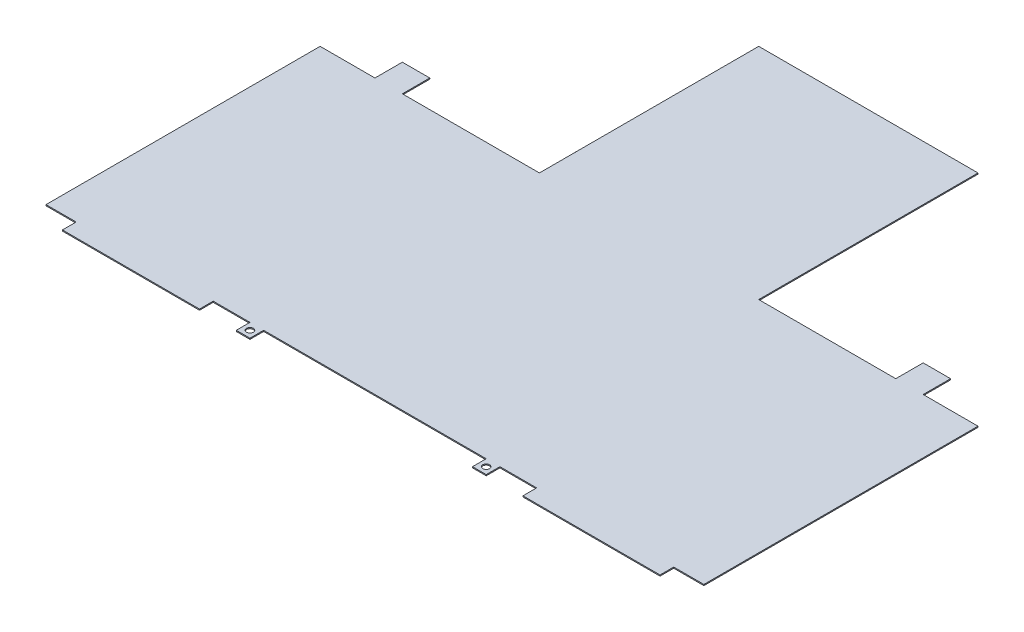
ISO-10303-21;
HEADER;
FILE_DESCRIPTION(('STEP AP214'),'2;1');
FILE_NAME('part.step','',(''),(''),'','','');
FILE_SCHEMA(('AUTOMOTIVE_DESIGN { 1 0 10303 214 1 1 1 1 }'));
ENDSEC;
DATA;
#1=APPLICATION_CONTEXT('core data for automotive mechanical design processes');
#2=APPLICATION_PROTOCOL_DEFINITION('international standard','automotive_design',2000,#1);
#3=PRODUCT_CONTEXT('',#1,'mechanical');
#4=PRODUCT('Part','Part','',(#3));
#5=PRODUCT_RELATED_PRODUCT_CATEGORY('part','',(#4));
#6=PRODUCT_DEFINITION_FORMATION('','',#4);
#7=PRODUCT_DEFINITION_CONTEXT('part definition',#1,'design');
#8=PRODUCT_DEFINITION('design','',#6,#7);
#9=PRODUCT_DEFINITION_SHAPE('','',#8);
#10=(LENGTH_UNIT() NAMED_UNIT(*) SI_UNIT(.MILLI.,.METRE.));
#11=(NAMED_UNIT(*) PLANE_ANGLE_UNIT() SI_UNIT($,.RADIAN.));
#12=(NAMED_UNIT(*) SI_UNIT($,.STERADIAN.) SOLID_ANGLE_UNIT());
#13=UNCERTAINTY_MEASURE_WITH_UNIT(LENGTH_MEASURE(1.E-05),#10,'distance_accuracy_value','');
#14=(GEOMETRIC_REPRESENTATION_CONTEXT(3) GLOBAL_UNCERTAINTY_ASSIGNED_CONTEXT((#13)) GLOBAL_UNIT_ASSIGNED_CONTEXT((#10,
#11,#12)) REPRESENTATION_CONTEXT('',''));
#15=CARTESIAN_POINT('',(0.,0.,0.));
#16=DIRECTION('',(0.,0.,1.));
#17=DIRECTION('',(1.,0.,0.));
#18=AXIS2_PLACEMENT_3D('',#15,#16,#17);
#19=CARTESIAN_POINT('',(-304.8,-1.,127.));
#20=DIRECTION('',(0.,0.,1.));
#21=DIRECTION('',(1.,0.,0.));
#22=AXIS2_PLACEMENT_3D('',#19,#20,#21);
#23=PLANE('',#22);
#24=DIRECTION('',(0.,1.,0.));
#25=VECTOR('',#24,1.);
#26=CARTESIAN_POINT('',(103.1,-1.,127.));
#27=LINE('',#26,#25);
#28=CARTESIAN_POINT('',(103.1,-1.,127.));
#29=VERTEX_POINT('',#28);
#30=CARTESIAN_POINT('',(103.1,0.,127.));
#31=VERTEX_POINT('',#30);
#32=EDGE_CURVE('E274',#29,#31,#27,.T.);
#33=ORIENTED_EDGE('',*,*,#32,.T.);
#34=DIRECTION('',(1.,0.,0.));
#35=VECTOR('',#34,1.);
#36=CARTESIAN_POINT('',(-304.8,0.,127.));
#37=LINE('',#36,#35);
#38=CARTESIAN_POINT('',(-103.1,0.,127.));
#39=VERTEX_POINT('',#38);
#40=EDGE_CURVE('E398',#39,#31,#37,.T.);
#41=ORIENTED_EDGE('',*,*,#40,.F.);
#42=DIRECTION('',(0.,1.,0.));
#43=VECTOR('',#42,1.);
#44=CARTESIAN_POINT('',(-103.1,-1.,127.));
#45=LINE('',#44,#43);
#46=CARTESIAN_POINT('',(-103.1,-1.,127.));
#47=VERTEX_POINT('',#46);
#48=EDGE_CURVE('E308',#47,#39,#45,.T.);
#49=ORIENTED_EDGE('',*,*,#48,.F.);
#50=DIRECTION('',(1.,0.,0.));
#51=VECTOR('',#50,1.);
#52=CARTESIAN_POINT('',(-304.8,-1.,127.));
#53=LINE('',#52,#51);
#54=EDGE_CURVE('E400',#47,#29,#53,.T.);
#55=ORIENTED_EDGE('',*,*,#54,.T.);
#56=EDGE_LOOP('',(#33,#41,#49,#55));
#57=FACE_BOUND('',#56,.T.);
#58=ADVANCED_FACE('F37',(#57),#23,.T.);
#59=DIRECTION('',(0.,1.,0.));
#60=VECTOR('',#59,1.);
#61=CARTESIAN_POINT('',(-115.8,-1.,127.));
#62=LINE('',#61,#60);
#63=CARTESIAN_POINT('',(-115.8,-1.,127.));
#64=VERTEX_POINT('',#63);
#65=CARTESIAN_POINT('',(-115.8,0.,127.));
#66=VERTEX_POINT('',#65);
#67=EDGE_CURVE('E304',#64,#66,#62,.T.);
#68=ORIENTED_EDGE('',*,*,#67,.T.);
#69=CARTESIAN_POINT('',(-149.86,0.,127.));
#70=VERTEX_POINT('',#69);
#71=EDGE_CURVE('E391',#70,#66,#37,.T.);
#72=ORIENTED_EDGE('',*,*,#71,.F.);
#73=DIRECTION('',(0.,1.,0.));
#74=VECTOR('',#73,1.);
#75=CARTESIAN_POINT('',(-149.86,-1.,127.));
#76=LINE('',#75,#74);
#77=CARTESIAN_POINT('',(-149.86,-1.,127.));
#78=VERTEX_POINT('',#77);
#79=EDGE_CURVE('E342',#78,#70,#76,.T.);
#80=ORIENTED_EDGE('',*,*,#79,.F.);
#81=EDGE_CURVE('E401',#78,#64,#53,.T.);
#82=ORIENTED_EDGE('',*,*,#81,.T.);
#83=EDGE_LOOP('',(#68,#72,#80,#82));
#84=FACE_BOUND('',#83,.T.);
#85=ADVANCED_FACE('F424',(#84),#23,.T.);
#86=DIRECTION('',(0.,1.,0.));
#87=VECTOR('',#86,1.);
#88=CARTESIAN_POINT('',(115.8,-1.,127.));
#89=LINE('',#88,#87);
#90=CARTESIAN_POINT('',(115.8,-1.,127.));
#91=VERTEX_POINT('',#90);
#92=CARTESIAN_POINT('',(115.8,0.,127.));
#93=VERTEX_POINT('',#92);
#94=EDGE_CURVE('E287',#91,#93,#89,.T.);
#95=ORIENTED_EDGE('',*,*,#94,.F.);
#96=CARTESIAN_POINT('',(149.859999999997,-1.,127.));
#97=VERTEX_POINT('',#96);
#98=EDGE_CURVE('E41',#91,#97,#53,.T.);
#99=ORIENTED_EDGE('',*,*,#98,.T.);
#100=DIRECTION('',(0.,1.,0.));
#101=VECTOR('',#100,1.);
#102=CARTESIAN_POINT('',(149.859999999997,-1.,127.));
#103=LINE('',#102,#101);
#104=CARTESIAN_POINT('',(149.859999999997,0.,127.));
#105=VERTEX_POINT('',#104);
#106=EDGE_CURVE('E329',#97,#105,#103,.T.);
#107=ORIENTED_EDGE('',*,*,#106,.T.);
#108=EDGE_CURVE('E380',#93,#105,#37,.T.);
#109=ORIENTED_EDGE('',*,*,#108,.F.);
#110=EDGE_LOOP('',(#95,#99,#107,#109));
#111=FACE_BOUND('',#110,.T.);
#112=ADVANCED_FACE('F516',(#111),#23,.T.);
#113=CARTESIAN_POINT('',(-304.8,-1.,127.));
#114=VERTEX_POINT('',#113);
#115=CARTESIAN_POINT('',(-276.86,-1.,127.));
#116=VERTEX_POINT('',#115);
#117=EDGE_CURVE('E413',#114,#116,#53,.T.);
#118=ORIENTED_EDGE('',*,*,#117,.T.);
#119=DIRECTION('',(0.,1.,0.));
#120=VECTOR('',#119,1.);
#121=CARTESIAN_POINT('',(-276.86,-1.,127.));
#122=LINE('',#121,#120);
#123=CARTESIAN_POINT('',(-276.86,0.,127.));
#124=VERTEX_POINT('',#123);
#125=EDGE_CURVE('E354',#116,#124,#122,.T.);
#126=ORIENTED_EDGE('',*,*,#125,.T.);
#127=CARTESIAN_POINT('',(-304.8,0.,127.));
#128=VERTEX_POINT('',#127);
#129=EDGE_CURVE('E396',#128,#124,#37,.T.);
#130=ORIENTED_EDGE('',*,*,#129,.F.);
#131=DIRECTION('',(0.,1.,0.));
#132=VECTOR('',#131,1.);
#133=CARTESIAN_POINT('',(-304.8,-1.,127.));
#134=LINE('',#133,#132);
#135=EDGE_CURVE('E47',#114,#128,#134,.T.);
#136=ORIENTED_EDGE('',*,*,#135,.F.);
#137=EDGE_LOOP('',(#118,#126,#130,#136));
#138=FACE_BOUND('',#137,.T.);
#139=ADVANCED_FACE('F487',(#138),#23,.T.);
#140=CARTESIAN_POINT('',(-304.8,-1.,-127.));
#141=DIRECTION('',(0.,0.,-1.));
#142=DIRECTION('',(-1.,0.,0.));
#143=AXIS2_PLACEMENT_3D('',#140,#141,#142);
#144=PLANE('',#143);
#145=DIRECTION('',(0.,1.,0.));
#146=VECTOR('',#145,1.);
#147=CARTESIAN_POINT('',(-101.6,-1.,-127.));
#148=LINE('',#147,#146);
#149=CARTESIAN_POINT('',(-101.6,-1.,-127.));
#150=VERTEX_POINT('',#149);
#151=CARTESIAN_POINT('',(-101.6,0.,-127.));
#152=VERTEX_POINT('',#151);
#153=EDGE_CURVE('E635',#150,#152,#148,.T.);
#154=ORIENTED_EDGE('',*,*,#153,.F.);
#155=DIRECTION('',(-1.,0.,0.));
#156=VECTOR('',#155,1.);
#157=CARTESIAN_POINT('',(-304.8,-1.,-127.));
#158=LINE('',#157,#156);
#159=CARTESIAN_POINT('',(-228.6,-1.,-127.));
#160=VERTEX_POINT('',#159);
#161=EDGE_CURVE('E448',#150,#160,#158,.T.);
#162=ORIENTED_EDGE('',*,*,#161,.T.);
#163=DIRECTION('',(0.,1.,0.));
#164=VECTOR('',#163,1.);
#165=CARTESIAN_POINT('',(-228.6,-1.,-127.));
#166=LINE('',#165,#164);
#167=CARTESIAN_POINT('',(-228.6,0.,-127.));
#168=VERTEX_POINT('',#167);
#169=EDGE_CURVE('E597',#160,#168,#166,.T.);
#170=ORIENTED_EDGE('',*,*,#169,.T.);
#171=DIRECTION('',(-1.,0.,0.));
#172=VECTOR('',#171,1.);
#173=CARTESIAN_POINT('',(-304.8,0.,-127.));
#174=LINE('',#173,#172);
#175=EDGE_CURVE('E468',#152,#168,#174,.T.);
#176=ORIENTED_EDGE('',*,*,#175,.F.);
#177=EDGE_LOOP('',(#154,#162,#170,#176));
#178=FACE_BOUND('',#177,.T.);
#179=ADVANCED_FACE('F529',(#178),#144,.T.);
#180=DIRECTION('',(0.,1.,0.));
#181=VECTOR('',#180,1.);
#182=CARTESIAN_POINT('',(101.6,-1.,-127.));
#183=LINE('',#182,#181);
#184=CARTESIAN_POINT('',(101.6,-1.,-127.));
#185=VERTEX_POINT('',#184);
#186=CARTESIAN_POINT('',(101.6,0.,-127.));
#187=VERTEX_POINT('',#186);
#188=EDGE_CURVE('E638',#185,#187,#183,.T.);
#189=ORIENTED_EDGE('',*,*,#188,.T.);
#190=CARTESIAN_POINT('',(228.6,0.,-127.));
#191=VERTEX_POINT('',#190);
#192=EDGE_CURVE('E466',#191,#187,#174,.T.);
#193=ORIENTED_EDGE('',*,*,#192,.F.);
#194=DIRECTION('',(0.,1.,0.));
#195=VECTOR('',#194,1.);
#196=CARTESIAN_POINT('',(228.6,-1.,-127.));
#197=LINE('',#196,#195);
#198=CARTESIAN_POINT('',(228.6,-1.,-127.));
#199=VERTEX_POINT('',#198);
#200=EDGE_CURVE('E562',#199,#191,#197,.T.);
#201=ORIENTED_EDGE('',*,*,#200,.F.);
#202=EDGE_CURVE('E462',#199,#185,#158,.T.);
#203=ORIENTED_EDGE('',*,*,#202,.T.);
#204=EDGE_LOOP('',(#189,#193,#201,#203));
#205=FACE_BOUND('',#204,.T.);
#206=ADVANCED_FACE('F534',(#205),#144,.T.);
#207=DIRECTION('',(0.,1.,0.));
#208=VECTOR('',#207,1.);
#209=CARTESIAN_POINT('',(254.,-1.,-127.));
#210=LINE('',#209,#208);
#211=CARTESIAN_POINT('',(254.,-1.,-127.));
#212=VERTEX_POINT('',#211);
#213=CARTESIAN_POINT('',(254.,0.,-127.));
#214=VERTEX_POINT('',#213);
#215=EDGE_CURVE('E551',#212,#214,#210,.T.);
#216=ORIENTED_EDGE('',*,*,#215,.T.);
#217=CARTESIAN_POINT('',(304.8,0.,-127.));
#218=VERTEX_POINT('',#217);
#219=EDGE_CURVE('E475',#218,#214,#174,.T.);
#220=ORIENTED_EDGE('',*,*,#219,.F.);
#221=DIRECTION('',(0.,1.,0.));
#222=VECTOR('',#221,1.);
#223=CARTESIAN_POINT('',(304.8,-1.,-127.));
#224=LINE('',#223,#222);
#225=CARTESIAN_POINT('',(304.8,-1.,-127.));
#226=VERTEX_POINT('',#225);
#227=EDGE_CURVE('E415',#226,#218,#224,.T.);
#228=ORIENTED_EDGE('',*,*,#227,.F.);
#229=EDGE_CURVE('E459',#226,#212,#158,.T.);
#230=ORIENTED_EDGE('',*,*,#229,.T.);
#231=EDGE_LOOP('',(#216,#220,#228,#230));
#232=FACE_BOUND('',#231,.T.);
#233=ADVANCED_FACE('F526',(#232),#144,.T.);
#234=CARTESIAN_POINT('',(304.8,-1.,127.));
#235=DIRECTION('',(1.,0.,0.));
#236=DIRECTION('',(0.,0.,-1.));
#237=AXIS2_PLACEMENT_3D('',#234,#235,#236);
#238=PLANE('',#237);
#239=DIRECTION('',(0.,0.,-1.));
#240=VECTOR('',#239,1.);
#241=CARTESIAN_POINT('',(304.8,0.,127.));
#242=LINE('',#241,#240);
#243=CARTESIAN_POINT('',(304.8,0.,127.));
#244=VERTEX_POINT('',#243);
#245=EDGE_CURVE('E407',#244,#218,#242,.T.);
#246=ORIENTED_EDGE('',*,*,#245,.F.);
#247=DIRECTION('',(0.,1.,0.));
#248=VECTOR('',#247,1.);
#249=CARTESIAN_POINT('',(304.8,-1.,127.));
#250=LINE('',#249,#248);
#251=CARTESIAN_POINT('',(304.8,-1.,127.));
#252=VERTEX_POINT('',#251);
#253=EDGE_CURVE('E11',#252,#244,#250,.T.);
#254=ORIENTED_EDGE('',*,*,#253,.F.);
#255=DIRECTION('',(0.,0.,-1.));
#256=VECTOR('',#255,1.);
#257=CARTESIAN_POINT('',(304.8,-1.,127.));
#258=LINE('',#257,#256);
#259=EDGE_CURVE('E439',#252,#226,#258,.T.);
#260=ORIENTED_EDGE('',*,*,#259,.T.);
#261=ORIENTED_EDGE('',*,*,#227,.T.);
#262=EDGE_LOOP('',(#246,#254,#260,#261));
#263=FACE_BOUND('',#262,.T.);
#264=ADVANCED_FACE('F39',(#263),#238,.T.);
#265=DIRECTION('',(0.,1.,0.));
#266=VECTOR('',#265,1.);
#267=CARTESIAN_POINT('',(276.859999999999,-1.,127.));
#268=LINE('',#267,#266);
#269=CARTESIAN_POINT('',(276.859999999999,-1.,127.));
#270=VERTEX_POINT('',#269);
#271=CARTESIAN_POINT('',(276.859999999999,0.,127.));
#272=VERTEX_POINT('',#271);
#273=EDGE_CURVE('E333',#270,#272,#268,.T.);
#274=ORIENTED_EDGE('',*,*,#273,.F.);
#275=EDGE_CURVE('E382',#270,#252,#53,.T.);
#276=ORIENTED_EDGE('',*,*,#275,.T.);
#277=ORIENTED_EDGE('',*,*,#253,.T.);
#278=EDGE_CURVE('E377',#272,#244,#37,.T.);
#279=ORIENTED_EDGE('',*,*,#278,.F.);
#280=EDGE_LOOP('',(#274,#276,#277,#279));
#281=FACE_BOUND('',#280,.T.);
#282=ADVANCED_FACE('F512',(#281),#23,.T.);
#283=CARTESIAN_POINT('',(-304.8,-1.,127.));
#284=DIRECTION('',(-1.,0.,0.));
#285=DIRECTION('',(0.,0.,1.));
#286=AXIS2_PLACEMENT_3D('',#283,#284,#285);
#287=PLANE('',#286);
#288=DIRECTION('',(0.,0.,1.));
#289=VECTOR('',#288,1.);
#290=CARTESIAN_POINT('',(-304.8,0.,127.));
#291=LINE('',#290,#289);
#292=CARTESIAN_POINT('',(-304.8,0.,-127.));
#293=VERTEX_POINT('',#292);
#294=EDGE_CURVE('E381',#293,#128,#291,.T.);
#295=ORIENTED_EDGE('',*,*,#294,.F.);
#296=DIRECTION('',(0.,1.,0.));
#297=VECTOR('',#296,1.);
#298=CARTESIAN_POINT('',(-304.8,-1.,-127.));
#299=LINE('',#298,#297);
#300=CARTESIAN_POINT('',(-304.8,-1.,-127.));
#301=VERTEX_POINT('',#300);
#302=EDGE_CURVE('E418',#301,#293,#299,.T.);
#303=ORIENTED_EDGE('',*,*,#302,.F.);
#304=DIRECTION('',(0.,0.,1.));
#305=VECTOR('',#304,1.);
#306=CARTESIAN_POINT('',(-304.8,-1.,127.));
#307=LINE('',#306,#305);
#308=EDGE_CURVE('E405',#301,#114,#307,.T.);
#309=ORIENTED_EDGE('',*,*,#308,.T.);
#310=ORIENTED_EDGE('',*,*,#135,.T.);
#311=EDGE_LOOP('',(#295,#303,#309,#310));
#312=FACE_BOUND('',#311,.T.);
#313=ADVANCED_FACE('F482',(#312),#287,.T.);
#314=DIRECTION('',(0.,1.,0.));
#315=VECTOR('',#314,1.);
#316=CARTESIAN_POINT('',(-254.,-1.,-127.));
#317=LINE('',#316,#315);
#318=CARTESIAN_POINT('',(-254.,-1.,-127.));
#319=VERTEX_POINT('',#318);
#320=CARTESIAN_POINT('',(-254.,0.,-127.));
#321=VERTEX_POINT('',#320);
#322=EDGE_CURVE('E587',#319,#321,#317,.T.);
#323=ORIENTED_EDGE('',*,*,#322,.F.);
#324=EDGE_CURVE('E444',#319,#301,#158,.T.);
#325=ORIENTED_EDGE('',*,*,#324,.T.);
#326=ORIENTED_EDGE('',*,*,#302,.T.);
#327=EDGE_CURVE('E469',#321,#293,#174,.T.);
#328=ORIENTED_EDGE('',*,*,#327,.F.);
#329=EDGE_LOOP('',(#323,#325,#326,#328));
#330=FACE_BOUND('',#329,.T.);
#331=ADVANCED_FACE('F525',(#330),#144,.T.);
#332=CARTESIAN_POINT('',(0.,-1.,0.));
#333=DIRECTION('',(0.,-1.,0.));
#334=DIRECTION('',(0.,0.,-1.));
#335=AXIS2_PLACEMENT_3D('',#332,#333,#334);
#336=PLANE('',#335);
#337=CARTESIAN_POINT('',(109.45,-1.,133.35));
#338=DIRECTION('',(0.,-1.,0.));
#339=DIRECTION('',(0.,0.,-1.));
#340=AXIS2_PLACEMENT_3D('',#337,#338,#339);
#341=CIRCLE('',#340,3.15);
#342=CARTESIAN_POINT('',(109.45,-1.,130.2));
#343=VERTEX_POINT('',#342);
#344=EDGE_CURVE('E859',#343,#343,#341,.T.);
#345=ORIENTED_EDGE('',*,*,#344,.F.);
#346=EDGE_LOOP('',(#345));
#347=FACE_BOUND('',#346,.T.);
#348=CARTESIAN_POINT('',(-109.45,-1.,133.35));
#349=DIRECTION('',(0.,-1.,0.));
#350=DIRECTION('',(0.,0.,-1.));
#351=AXIS2_PLACEMENT_3D('',#348,#349,#350);
#352=CIRCLE('',#351,3.15);
#353=CARTESIAN_POINT('',(-109.45,-1.,130.2));
#354=VERTEX_POINT('',#353);
#355=EDGE_CURVE('E278',#354,#354,#352,.T.);
#356=ORIENTED_EDGE('',*,*,#355,.F.);
#357=EDGE_LOOP('',(#356));
#358=FACE_BOUND('',#357,.T.);
#359=ORIENTED_EDGE('',*,*,#259,.F.);
#360=ORIENTED_EDGE('',*,*,#275,.F.);
#361=DIRECTION('',(0.,0.,-1.));
#362=VECTOR('',#361,1.);
#363=CARTESIAN_POINT('',(276.859999999999,-1.,127.));
#364=LINE('',#363,#362);
#365=CARTESIAN_POINT('',(276.859999999999,-1.,139.7));
#366=VERTEX_POINT('',#365);
#367=EDGE_CURVE('E320',#366,#270,#364,.T.);
#368=ORIENTED_EDGE('',*,*,#367,.F.);
#369=DIRECTION('',(1.,0.,0.));
#370=VECTOR('',#369,1.);
#371=CARTESIAN_POINT('',(149.859999999997,-1.,139.7));
#372=LINE('',#371,#370);
#373=CARTESIAN_POINT('',(149.859999999997,-1.,139.7));
#374=VERTEX_POINT('',#373);
#375=EDGE_CURVE('E316',#374,#366,#372,.T.);
#376=ORIENTED_EDGE('',*,*,#375,.F.);
#377=DIRECTION('',(0.,0.,1.));
#378=VECTOR('',#377,1.);
#379=CARTESIAN_POINT('',(149.859999999997,-1.,127.));
#380=LINE('',#379,#378);
#381=EDGE_CURVE('E313',#97,#374,#380,.T.);
#382=ORIENTED_EDGE('',*,*,#381,.F.);
#383=ORIENTED_EDGE('',*,*,#98,.F.);
#384=DIRECTION('',(0.,0.,-1.));
#385=VECTOR('',#384,1.);
#386=CARTESIAN_POINT('',(115.8,-1.,127.));
#387=LINE('',#386,#385);
#388=CARTESIAN_POINT('',(115.8,-1.,139.7));
#389=VERTEX_POINT('',#388);
#390=EDGE_CURVE('E260',#389,#91,#387,.T.);
#391=ORIENTED_EDGE('',*,*,#390,.F.);
#392=DIRECTION('',(1.,0.,0.));
#393=VECTOR('',#392,1.);
#394=CARTESIAN_POINT('',(103.1,-1.,139.7));
#395=LINE('',#394,#393);
#396=CARTESIAN_POINT('',(103.1,-1.,139.7));
#397=VERTEX_POINT('',#396);
#398=EDGE_CURVE('E254',#397,#389,#395,.T.);
#399=ORIENTED_EDGE('',*,*,#398,.F.);
#400=DIRECTION('',(0.,0.,1.));
#401=VECTOR('',#400,1.);
#402=CARTESIAN_POINT('',(103.1,-1.,127.));
#403=LINE('',#402,#401);
#404=EDGE_CURVE('E268',#29,#397,#403,.T.);
#405=ORIENTED_EDGE('',*,*,#404,.F.);
#406=ORIENTED_EDGE('',*,*,#54,.F.);
#407=DIRECTION('',(0.,0.,-1.));
#408=VECTOR('',#407,1.);
#409=CARTESIAN_POINT('',(-103.1,-1.,127.));
#410=LINE('',#409,#408);
#411=CARTESIAN_POINT('',(-103.1,-1.,139.7));
#412=VERTEX_POINT('',#411);
#413=EDGE_CURVE('E296',#412,#47,#410,.T.);
#414=ORIENTED_EDGE('',*,*,#413,.F.);
#415=DIRECTION('',(1.,0.,0.));
#416=VECTOR('',#415,1.);
#417=CARTESIAN_POINT('',(-115.8,-1.,139.7));
#418=LINE('',#417,#416);
#419=CARTESIAN_POINT('',(-115.8,-1.,139.7));
#420=VERTEX_POINT('',#419);
#421=EDGE_CURVE('E293',#420,#412,#418,.T.);
#422=ORIENTED_EDGE('',*,*,#421,.F.);
#423=DIRECTION('',(0.,0.,1.));
#424=VECTOR('',#423,1.);
#425=CARTESIAN_POINT('',(-115.8,-1.,127.));
#426=LINE('',#425,#424);
#427=EDGE_CURVE('E290',#64,#420,#426,.T.);
#428=ORIENTED_EDGE('',*,*,#427,.F.);
#429=ORIENTED_EDGE('',*,*,#81,.F.);
#430=DIRECTION('',(0.,0.,-1.));
#431=VECTOR('',#430,1.);
#432=CARTESIAN_POINT('',(-149.86,-1.,139.7));
#433=LINE('',#432,#431);
#434=CARTESIAN_POINT('',(-149.86,-1.,139.7));
#435=VERTEX_POINT('',#434);
#436=EDGE_CURVE('E347',#435,#78,#433,.T.);
#437=ORIENTED_EDGE('',*,*,#436,.F.);
#438=DIRECTION('',(1.,0.,0.));
#439=VECTOR('',#438,1.);
#440=CARTESIAN_POINT('',(-149.86,-1.,139.7));
#441=LINE('',#440,#439);
#442=CARTESIAN_POINT('',(-276.86,-1.,139.7));
#443=VERTEX_POINT('',#442);
#444=EDGE_CURVE('E339',#443,#435,#441,.T.);
#445=ORIENTED_EDGE('',*,*,#444,.F.);
#446=DIRECTION('',(0.,0.,1.));
#447=VECTOR('',#446,1.);
#448=CARTESIAN_POINT('',(-276.86,-1.,139.7));
#449=LINE('',#448,#447);
#450=EDGE_CURVE('E343',#116,#443,#449,.T.);
#451=ORIENTED_EDGE('',*,*,#450,.F.);
#452=ORIENTED_EDGE('',*,*,#117,.F.);
#453=ORIENTED_EDGE('',*,*,#308,.F.);
#454=ORIENTED_EDGE('',*,*,#324,.F.);
#455=DIRECTION('',(0.,0.,1.));
#456=VECTOR('',#455,1.);
#457=CARTESIAN_POINT('',(-254.,-1.,-152.4));
#458=LINE('',#457,#456);
#459=CARTESIAN_POINT('',(-254.,-1.,-152.4));
#460=VERTEX_POINT('',#459);
#461=EDGE_CURVE('E592',#460,#319,#458,.T.);
#462=ORIENTED_EDGE('',*,*,#461,.F.);
#463=DIRECTION('',(-1.,0.,0.));
#464=VECTOR('',#463,1.);
#465=CARTESIAN_POINT('',(-254.,-1.,-152.4));
#466=LINE('',#465,#464);
#467=CARTESIAN_POINT('',(-228.6,-1.,-152.4));
#468=VERTEX_POINT('',#467);
#469=EDGE_CURVE('E584',#468,#460,#466,.T.);
#470=ORIENTED_EDGE('',*,*,#469,.F.);
#471=DIRECTION('',(0.,0.,-1.));
#472=VECTOR('',#471,1.);
#473=CARTESIAN_POINT('',(-228.6,-1.,-152.4));
#474=LINE('',#473,#472);
#475=EDGE_CURVE('E588',#160,#468,#474,.T.);
#476=ORIENTED_EDGE('',*,*,#475,.F.);
#477=ORIENTED_EDGE('',*,*,#161,.F.);
#478=DIRECTION('',(0.,0.,1.));
#479=VECTOR('',#478,1.);
#480=CARTESIAN_POINT('',(-101.6,-1.,-330.2));
#481=LINE('',#480,#479);
#482=CARTESIAN_POINT('',(-101.6,-1.,-330.2));
#483=VERTEX_POINT('',#482);
#484=EDGE_CURVE('E652',#483,#150,#481,.T.);
#485=ORIENTED_EDGE('',*,*,#484,.F.);
#486=DIRECTION('',(-1.,0.,0.));
#487=VECTOR('',#486,1.);
#488=CARTESIAN_POINT('',(-101.6,-1.,-330.2));
#489=LINE('',#488,#487);
#490=CARTESIAN_POINT('',(101.6,-1.,-330.2));
#491=VERTEX_POINT('',#490);
#492=EDGE_CURVE('E639',#491,#483,#489,.T.);
#493=ORIENTED_EDGE('',*,*,#492,.F.);
#494=DIRECTION('',(0.,0.,-1.));
#495=VECTOR('',#494,1.);
#496=CARTESIAN_POINT('',(101.6,-1.,-330.2));
#497=LINE('',#496,#495);
#498=EDGE_CURVE('E644',#185,#491,#497,.T.);
#499=ORIENTED_EDGE('',*,*,#498,.F.);
#500=ORIENTED_EDGE('',*,*,#202,.F.);
#501=DIRECTION('',(0.,0.,1.));
#502=VECTOR('',#501,1.);
#503=CARTESIAN_POINT('',(228.6,-1.,-152.4));
#504=LINE('',#503,#502);
#505=CARTESIAN_POINT('',(228.6,-1.,-152.4));
#506=VERTEX_POINT('',#505);
#507=EDGE_CURVE('E560',#506,#199,#504,.T.);
#508=ORIENTED_EDGE('',*,*,#507,.F.);
#509=DIRECTION('',(-1.,0.,0.));
#510=VECTOR('',#509,1.);
#511=CARTESIAN_POINT('',(228.6,-1.,-152.4));
#512=LINE('',#511,#510);
#513=CARTESIAN_POINT('',(254.,-1.,-152.4));
#514=VERTEX_POINT('',#513);
#515=EDGE_CURVE('E558',#514,#506,#512,.T.);
#516=ORIENTED_EDGE('',*,*,#515,.F.);
#517=DIRECTION('',(0.,0.,-1.));
#518=VECTOR('',#517,1.);
#519=CARTESIAN_POINT('',(254.,-1.,-152.4));
#520=LINE('',#519,#518);
#521=EDGE_CURVE('E555',#212,#514,#520,.T.);
#522=ORIENTED_EDGE('',*,*,#521,.F.);
#523=ORIENTED_EDGE('',*,*,#229,.F.);
#524=EDGE_LOOP('',(#359,#360,#368,#376,#382,#383,#391,#399,#405,#406,#414,#422,#428,#429,#437,
#445,#451,#452,#453,#454,#462,#470,#476,#477,#485,#493,#499,#500,#508,#516,#522,#523));
#525=FACE_BOUND('',#524,.T.);
#526=ADVANCED_FACE('F266',(#347,#358,#525),#336,.T.);
#527=CARTESIAN_POINT('',(0.,0.,0.));
#528=DIRECTION('',(0.,-1.,0.));
#529=DIRECTION('',(0.,0.,-1.));
#530=AXIS2_PLACEMENT_3D('',#527,#528,#529);
#531=PLANE('',#530);
#532=CARTESIAN_POINT('',(109.45,0.,133.35));
#533=DIRECTION('',(0.,1.,0.));
#534=DIRECTION('',(0.,0.,1.));
#535=AXIS2_PLACEMENT_3D('',#532,#533,#534);
#536=CIRCLE('',#535,3.15);
#537=CARTESIAN_POINT('',(109.45,0.,136.5));
#538=VERTEX_POINT('',#537);
#539=EDGE_CURVE('E862',#538,#538,#536,.T.);
#540=ORIENTED_EDGE('',*,*,#539,.F.);
#541=EDGE_LOOP('',(#540));
#542=FACE_BOUND('',#541,.T.);
#543=CARTESIAN_POINT('',(-109.45,0.,133.35));
#544=DIRECTION('',(0.,1.,0.));
#545=DIRECTION('',(0.,0.,1.));
#546=AXIS2_PLACEMENT_3D('',#543,#544,#545);
#547=CIRCLE('',#546,3.15);
#548=CARTESIAN_POINT('',(-109.45,0.,136.5));
#549=VERTEX_POINT('',#548);
#550=EDGE_CURVE('E864',#549,#549,#547,.T.);
#551=ORIENTED_EDGE('',*,*,#550,.F.);
#552=EDGE_LOOP('',(#551));
#553=FACE_BOUND('',#552,.T.);
#554=ORIENTED_EDGE('',*,*,#245,.T.);
#555=ORIENTED_EDGE('',*,*,#219,.T.);
#556=DIRECTION('',(0.,0.,-1.));
#557=VECTOR('',#556,1.);
#558=CARTESIAN_POINT('',(254.,0.,-152.4));
#559=LINE('',#558,#557);
#560=CARTESIAN_POINT('',(254.,0.,-152.4));
#561=VERTEX_POINT('',#560);
#562=EDGE_CURVE('E570',#214,#561,#559,.T.);
#563=ORIENTED_EDGE('',*,*,#562,.T.);
#564=DIRECTION('',(-1.,0.,0.));
#565=VECTOR('',#564,1.);
#566=CARTESIAN_POINT('',(228.6,0.,-152.4));
#567=LINE('',#566,#565);
#568=CARTESIAN_POINT('',(228.6,0.,-152.4));
#569=VERTEX_POINT('',#568);
#570=EDGE_CURVE('E564',#561,#569,#567,.T.);
#571=ORIENTED_EDGE('',*,*,#570,.T.);
#572=DIRECTION('',(0.,0.,1.));
#573=VECTOR('',#572,1.);
#574=CARTESIAN_POINT('',(228.6,0.,-152.4));
#575=LINE('',#574,#573);
#576=EDGE_CURVE('E568',#569,#191,#575,.T.);
#577=ORIENTED_EDGE('',*,*,#576,.T.);
#578=ORIENTED_EDGE('',*,*,#192,.T.);
#579=DIRECTION('',(0.,0.,-1.));
#580=VECTOR('',#579,1.);
#581=CARTESIAN_POINT('',(101.6,0.,-330.2));
#582=LINE('',#581,#580);
#583=CARTESIAN_POINT('',(101.6,0.,-330.2));
#584=VERTEX_POINT('',#583);
#585=EDGE_CURVE('E653',#187,#584,#582,.T.);
#586=ORIENTED_EDGE('',*,*,#585,.T.);
#587=DIRECTION('',(-1.,0.,0.));
#588=VECTOR('',#587,1.);
#589=CARTESIAN_POINT('',(-101.6,0.,-330.2));
#590=LINE('',#589,#588);
#591=CARTESIAN_POINT('',(-101.6,0.,-330.2));
#592=VERTEX_POINT('',#591);
#593=EDGE_CURVE('E649',#584,#592,#590,.T.);
#594=ORIENTED_EDGE('',*,*,#593,.T.);
#595=DIRECTION('',(0.,0.,1.));
#596=VECTOR('',#595,1.);
#597=CARTESIAN_POINT('',(-101.6,0.,-330.2));
#598=LINE('',#597,#596);
#599=EDGE_CURVE('E351',#592,#152,#598,.T.);
#600=ORIENTED_EDGE('',*,*,#599,.T.);
#601=ORIENTED_EDGE('',*,*,#175,.T.);
#602=DIRECTION('',(0.,0.,-1.));
#603=VECTOR('',#602,1.);
#604=CARTESIAN_POINT('',(-228.6,0.,-152.4));
#605=LINE('',#604,#603);
#606=CARTESIAN_POINT('',(-228.6,0.,-152.4));
#607=VERTEX_POINT('',#606);
#608=EDGE_CURVE('E593',#168,#607,#605,.T.);
#609=ORIENTED_EDGE('',*,*,#608,.T.);
#610=DIRECTION('',(-1.,0.,0.));
#611=VECTOR('',#610,1.);
#612=CARTESIAN_POINT('',(-254.,0.,-152.4));
#613=LINE('',#612,#611);
#614=CARTESIAN_POINT('',(-254.,0.,-152.4));
#615=VERTEX_POINT('',#614);
#616=EDGE_CURVE('E589',#607,#615,#613,.T.);
#617=ORIENTED_EDGE('',*,*,#616,.T.);
#618=DIRECTION('',(0.,0.,1.));
#619=VECTOR('',#618,1.);
#620=CARTESIAN_POINT('',(-254.,0.,-152.4));
#621=LINE('',#620,#619);
#622=EDGE_CURVE('E578',#615,#321,#621,.T.);
#623=ORIENTED_EDGE('',*,*,#622,.T.);
#624=ORIENTED_EDGE('',*,*,#327,.T.);
#625=ORIENTED_EDGE('',*,*,#294,.T.);
#626=ORIENTED_EDGE('',*,*,#129,.T.);
#627=DIRECTION('',(0.,0.,1.));
#628=VECTOR('',#627,1.);
#629=CARTESIAN_POINT('',(-276.86,0.,139.7));
#630=LINE('',#629,#628);
#631=CARTESIAN_POINT('',(-276.86,0.,139.7));
#632=VERTEX_POINT('',#631);
#633=EDGE_CURVE('E348',#124,#632,#630,.T.);
#634=ORIENTED_EDGE('',*,*,#633,.T.);
#635=DIRECTION('',(1.,0.,0.));
#636=VECTOR('',#635,1.);
#637=CARTESIAN_POINT('',(-149.86,0.,139.7));
#638=LINE('',#637,#636);
#639=CARTESIAN_POINT('',(-149.86,0.,139.7));
#640=VERTEX_POINT('',#639);
#641=EDGE_CURVE('E344',#632,#640,#638,.T.);
#642=ORIENTED_EDGE('',*,*,#641,.T.);
#643=DIRECTION('',(0.,0.,-1.));
#644=VECTOR('',#643,1.);
#645=CARTESIAN_POINT('',(-149.86,0.,139.7));
#646=LINE('',#645,#644);
#647=EDGE_CURVE('E332',#640,#70,#646,.T.);
#648=ORIENTED_EDGE('',*,*,#647,.T.);
#649=ORIENTED_EDGE('',*,*,#71,.T.);
#650=DIRECTION('',(0.,0.,1.));
#651=VECTOR('',#650,1.);
#652=CARTESIAN_POINT('',(-115.8,0.,127.));
#653=LINE('',#652,#651);
#654=CARTESIAN_POINT('',(-115.8,0.,139.7));
#655=VERTEX_POINT('',#654);
#656=EDGE_CURVE('E286',#66,#655,#653,.T.);
#657=ORIENTED_EDGE('',*,*,#656,.T.);
#658=DIRECTION('',(1.,0.,0.));
#659=VECTOR('',#658,1.);
#660=CARTESIAN_POINT('',(-115.8,0.,139.7));
#661=LINE('',#660,#659);
#662=CARTESIAN_POINT('',(-103.1,0.,139.7));
#663=VERTEX_POINT('',#662);
#664=EDGE_CURVE('E301',#655,#663,#661,.T.);
#665=ORIENTED_EDGE('',*,*,#664,.T.);
#666=DIRECTION('',(0.,0.,-1.));
#667=VECTOR('',#666,1.);
#668=CARTESIAN_POINT('',(-103.1,0.,127.));
#669=LINE('',#668,#667);
#670=EDGE_CURVE('E62',#663,#39,#669,.T.);
#671=ORIENTED_EDGE('',*,*,#670,.T.);
#672=ORIENTED_EDGE('',*,*,#40,.T.);
#673=DIRECTION('',(0.,0.,1.));
#674=VECTOR('',#673,1.);
#675=CARTESIAN_POINT('',(103.1,0.,127.));
#676=LINE('',#675,#674);
#677=CARTESIAN_POINT('',(103.1,0.,139.7));
#678=VERTEX_POINT('',#677);
#679=EDGE_CURVE('E282',#31,#678,#676,.T.);
#680=ORIENTED_EDGE('',*,*,#679,.T.);
#681=DIRECTION('',(1.,0.,0.));
#682=VECTOR('',#681,1.);
#683=CARTESIAN_POINT('',(103.1,0.,139.7));
#684=LINE('',#683,#682);
#685=CARTESIAN_POINT('',(115.8,0.,139.7));
#686=VERTEX_POINT('',#685);
#687=EDGE_CURVE('E255',#678,#686,#684,.T.);
#688=ORIENTED_EDGE('',*,*,#687,.T.);
#689=DIRECTION('',(0.,0.,-1.));
#690=VECTOR('',#689,1.);
#691=CARTESIAN_POINT('',(115.8,0.,127.));
#692=LINE('',#691,#690);
#693=EDGE_CURVE('E55',#686,#93,#692,.T.);
#694=ORIENTED_EDGE('',*,*,#693,.T.);
#695=ORIENTED_EDGE('',*,*,#108,.T.);
#696=DIRECTION('',(0.,0.,1.));
#697=VECTOR('',#696,1.);
#698=CARTESIAN_POINT('',(149.859999999997,0.,127.));
#699=LINE('',#698,#697);
#700=CARTESIAN_POINT('',(149.859999999997,0.,139.7));
#701=VERTEX_POINT('',#700);
#702=EDGE_CURVE('E307',#105,#701,#699,.T.);
#703=ORIENTED_EDGE('',*,*,#702,.T.);
#704=DIRECTION('',(1.,0.,0.));
#705=VECTOR('',#704,1.);
#706=CARTESIAN_POINT('',(149.859999999997,0.,139.7));
#707=LINE('',#706,#705);
#708=CARTESIAN_POINT('',(276.859999999999,0.,139.7));
#709=VERTEX_POINT('',#708);
#710=EDGE_CURVE('E325',#701,#709,#707,.T.);
#711=ORIENTED_EDGE('',*,*,#710,.T.);
#712=DIRECTION('',(0.,0.,-1.));
#713=VECTOR('',#712,1.);
#714=CARTESIAN_POINT('',(276.859999999999,0.,127.));
#715=LINE('',#714,#713);
#716=EDGE_CURVE('E317',#709,#272,#715,.T.);
#717=ORIENTED_EDGE('',*,*,#716,.T.);
#718=ORIENTED_EDGE('',*,*,#278,.T.);
#719=EDGE_LOOP('',(#554,#555,#563,#571,#577,#578,#586,#594,#600,#601,#609,#617,#623,#624,#625,
#626,#634,#642,#648,#649,#657,#665,#671,#672,#680,#688,#694,#695,#703,#711,#717,#718));
#720=FACE_BOUND('',#719,.T.);
#721=ADVANCED_FACE('F436',(#542,#553,#720),#531,.F.);
#722=CARTESIAN_POINT('',(-254.,-1.,-152.4));
#723=DIRECTION('',(-1.,0.,0.));
#724=DIRECTION('',(0.,0.,1.));
#725=AXIS2_PLACEMENT_3D('',#722,#723,#724);
#726=PLANE('',#725);
#727=ORIENTED_EDGE('',*,*,#622,.F.);
#728=DIRECTION('',(0.,1.,0.));
#729=VECTOR('',#728,1.);
#730=CARTESIAN_POINT('',(-254.,-1.,-152.4));
#731=LINE('',#730,#729);
#732=EDGE_CURVE('E594',#460,#615,#731,.T.);
#733=ORIENTED_EDGE('',*,*,#732,.F.);
#734=ORIENTED_EDGE('',*,*,#461,.T.);
#735=ORIENTED_EDGE('',*,*,#322,.T.);
#736=EDGE_LOOP('',(#727,#733,#734,#735));
#737=FACE_BOUND('',#736,.T.);
#738=ADVANCED_FACE('F625',(#737),#726,.T.);
#739=CARTESIAN_POINT('',(-254.,-1.,-152.4));
#740=DIRECTION('',(0.,0.,-1.));
#741=DIRECTION('',(-1.,0.,0.));
#742=AXIS2_PLACEMENT_3D('',#739,#740,#741);
#743=PLANE('',#742);
#744=ORIENTED_EDGE('',*,*,#616,.F.);
#745=DIRECTION('',(0.,1.,0.));
#746=VECTOR('',#745,1.);
#747=CARTESIAN_POINT('',(-228.6,-1.,-152.4));
#748=LINE('',#747,#746);
#749=EDGE_CURVE('E596',#468,#607,#748,.T.);
#750=ORIENTED_EDGE('',*,*,#749,.F.);
#751=ORIENTED_EDGE('',*,*,#469,.T.);
#752=ORIENTED_EDGE('',*,*,#732,.T.);
#753=EDGE_LOOP('',(#744,#750,#751,#752));
#754=FACE_BOUND('',#753,.T.);
#755=ADVANCED_FACE('F621',(#754),#743,.T.);
#756=CARTESIAN_POINT('',(-228.6,-1.,-152.4));
#757=DIRECTION('',(1.,0.,0.));
#758=DIRECTION('',(0.,0.,-1.));
#759=AXIS2_PLACEMENT_3D('',#756,#757,#758);
#760=PLANE('',#759);
#761=ORIENTED_EDGE('',*,*,#608,.F.);
#762=ORIENTED_EDGE('',*,*,#169,.F.);
#763=ORIENTED_EDGE('',*,*,#475,.T.);
#764=ORIENTED_EDGE('',*,*,#749,.T.);
#765=EDGE_LOOP('',(#761,#762,#763,#764));
#766=FACE_BOUND('',#765,.T.);
#767=ADVANCED_FACE('F632',(#766),#760,.T.);
#768=CARTESIAN_POINT('',(228.6,-1.,-152.4));
#769=DIRECTION('',(-1.,0.,0.));
#770=DIRECTION('',(0.,0.,1.));
#771=AXIS2_PLACEMENT_3D('',#768,#769,#770);
#772=PLANE('',#771);
#773=ORIENTED_EDGE('',*,*,#576,.F.);
#774=DIRECTION('',(0.,1.,0.));
#775=VECTOR('',#774,1.);
#776=CARTESIAN_POINT('',(228.6,-1.,-152.4));
#777=LINE('',#776,#775);
#778=EDGE_CURVE('E576',#506,#569,#777,.T.);
#779=ORIENTED_EDGE('',*,*,#778,.F.);
#780=ORIENTED_EDGE('',*,*,#507,.T.);
#781=ORIENTED_EDGE('',*,*,#200,.T.);
#782=EDGE_LOOP('',(#773,#779,#780,#781));
#783=FACE_BOUND('',#782,.T.);
#784=ADVANCED_FACE('F670',(#783),#772,.T.);
#785=CARTESIAN_POINT('',(228.6,-1.,-152.4));
#786=DIRECTION('',(0.,0.,-1.));
#787=DIRECTION('',(-1.,0.,0.));
#788=AXIS2_PLACEMENT_3D('',#785,#786,#787);
#789=PLANE('',#788);
#790=ORIENTED_EDGE('',*,*,#570,.F.);
#791=DIRECTION('',(0.,1.,0.));
#792=VECTOR('',#791,1.);
#793=CARTESIAN_POINT('',(254.,-1.,-152.4));
#794=LINE('',#793,#792);
#795=EDGE_CURVE('E579',#514,#561,#794,.T.);
#796=ORIENTED_EDGE('',*,*,#795,.F.);
#797=ORIENTED_EDGE('',*,*,#515,.T.);
#798=ORIENTED_EDGE('',*,*,#778,.T.);
#799=EDGE_LOOP('',(#790,#796,#797,#798));
#800=FACE_BOUND('',#799,.T.);
#801=ADVANCED_FACE('F673',(#800),#789,.T.);
#802=CARTESIAN_POINT('',(254.,-1.,-152.4));
#803=DIRECTION('',(1.,0.,0.));
#804=DIRECTION('',(0.,0.,-1.));
#805=AXIS2_PLACEMENT_3D('',#802,#803,#804);
#806=PLANE('',#805);
#807=ORIENTED_EDGE('',*,*,#562,.F.);
#808=ORIENTED_EDGE('',*,*,#215,.F.);
#809=ORIENTED_EDGE('',*,*,#521,.T.);
#810=ORIENTED_EDGE('',*,*,#795,.T.);
#811=EDGE_LOOP('',(#807,#808,#809,#810));
#812=FACE_BOUND('',#811,.T.);
#813=ADVANCED_FACE('F674',(#812),#806,.T.);
#814=CARTESIAN_POINT('',(-101.6,-1.,-330.2));
#815=DIRECTION('',(-1.,0.,0.));
#816=DIRECTION('',(0.,0.,1.));
#817=AXIS2_PLACEMENT_3D('',#814,#815,#816);
#818=PLANE('',#817);
#819=ORIENTED_EDGE('',*,*,#599,.F.);
#820=DIRECTION('',(0.,1.,0.));
#821=VECTOR('',#820,1.);
#822=CARTESIAN_POINT('',(-101.6,-1.,-330.2));
#823=LINE('',#822,#821);
#824=EDGE_CURVE('E571',#483,#592,#823,.T.);
#825=ORIENTED_EDGE('',*,*,#824,.F.);
#826=ORIENTED_EDGE('',*,*,#484,.T.);
#827=ORIENTED_EDGE('',*,*,#153,.T.);
#828=EDGE_LOOP('',(#819,#825,#826,#827));
#829=FACE_BOUND('',#828,.T.);
#830=ADVANCED_FACE('F658',(#829),#818,.T.);
#831=CARTESIAN_POINT('',(-101.6,-1.,-330.2));
#832=DIRECTION('',(0.,0.,-1.));
#833=DIRECTION('',(-1.,0.,0.));
#834=AXIS2_PLACEMENT_3D('',#831,#832,#833);
#835=PLANE('',#834);
#836=ORIENTED_EDGE('',*,*,#593,.F.);
#837=DIRECTION('',(0.,1.,0.));
#838=VECTOR('',#837,1.);
#839=CARTESIAN_POINT('',(101.6,-1.,-330.2));
#840=LINE('',#839,#838);
#841=EDGE_CURVE('E641',#491,#584,#840,.T.);
#842=ORIENTED_EDGE('',*,*,#841,.F.);
#843=ORIENTED_EDGE('',*,*,#492,.T.);
#844=ORIENTED_EDGE('',*,*,#824,.T.);
#845=EDGE_LOOP('',(#836,#842,#843,#844));
#846=FACE_BOUND('',#845,.T.);
#847=ADVANCED_FACE('F504',(#846),#835,.T.);
#848=CARTESIAN_POINT('',(101.6,-1.,-330.2));
#849=DIRECTION('',(1.,0.,0.));
#850=DIRECTION('',(0.,0.,-1.));
#851=AXIS2_PLACEMENT_3D('',#848,#849,#850);
#852=PLANE('',#851);
#853=ORIENTED_EDGE('',*,*,#585,.F.);
#854=ORIENTED_EDGE('',*,*,#188,.F.);
#855=ORIENTED_EDGE('',*,*,#498,.T.);
#856=ORIENTED_EDGE('',*,*,#841,.T.);
#857=EDGE_LOOP('',(#853,#854,#855,#856));
#858=FACE_BOUND('',#857,.T.);
#859=ADVANCED_FACE('F497',(#858),#852,.T.);
#860=CARTESIAN_POINT('',(-149.86,-1.,139.7));
#861=DIRECTION('',(1.,0.,0.));
#862=DIRECTION('',(0.,0.,-1.));
#863=AXIS2_PLACEMENT_3D('',#860,#861,#862);
#864=PLANE('',#863);
#865=ORIENTED_EDGE('',*,*,#647,.F.);
#866=DIRECTION('',(0.,1.,0.));
#867=VECTOR('',#866,1.);
#868=CARTESIAN_POINT('',(-149.86,-1.,139.7));
#869=LINE('',#868,#867);
#870=EDGE_CURVE('E349',#435,#640,#869,.T.);
#871=ORIENTED_EDGE('',*,*,#870,.F.);
#872=ORIENTED_EDGE('',*,*,#436,.T.);
#873=ORIENTED_EDGE('',*,*,#79,.T.);
#874=EDGE_LOOP('',(#865,#871,#872,#873));
#875=FACE_BOUND('',#874,.T.);
#876=ADVANCED_FACE('F495',(#875),#864,.T.);
#877=CARTESIAN_POINT('',(-149.86,-1.,139.7));
#878=DIRECTION('',(0.,0.,1.));
#879=DIRECTION('',(1.,0.,0.));
#880=AXIS2_PLACEMENT_3D('',#877,#878,#879);
#881=PLANE('',#880);
#882=ORIENTED_EDGE('',*,*,#641,.F.);
#883=DIRECTION('',(0.,1.,0.));
#884=VECTOR('',#883,1.);
#885=CARTESIAN_POINT('',(-276.86,-1.,139.7));
#886=LINE('',#885,#884);
#887=EDGE_CURVE('E352',#443,#632,#886,.T.);
#888=ORIENTED_EDGE('',*,*,#887,.F.);
#889=ORIENTED_EDGE('',*,*,#444,.T.);
#890=ORIENTED_EDGE('',*,*,#870,.T.);
#891=EDGE_LOOP('',(#882,#888,#889,#890));
#892=FACE_BOUND('',#891,.T.);
#893=ADVANCED_FACE('F493',(#892),#881,.T.);
#894=CARTESIAN_POINT('',(-276.86,-1.,139.7));
#895=DIRECTION('',(-1.,0.,0.));
#896=DIRECTION('',(0.,0.,1.));
#897=AXIS2_PLACEMENT_3D('',#894,#895,#896);
#898=PLANE('',#897);
#899=ORIENTED_EDGE('',*,*,#633,.F.);
#900=ORIENTED_EDGE('',*,*,#125,.F.);
#901=ORIENTED_EDGE('',*,*,#450,.T.);
#902=ORIENTED_EDGE('',*,*,#887,.T.);
#903=EDGE_LOOP('',(#899,#900,#901,#902));
#904=FACE_BOUND('',#903,.T.);
#905=ADVANCED_FACE('F490',(#904),#898,.T.);
#906=CARTESIAN_POINT('',(149.859999999997,-1.,127.));
#907=DIRECTION('',(-1.,0.,0.));
#908=DIRECTION('',(0.,0.,1.));
#909=AXIS2_PLACEMENT_3D('',#906,#907,#908);
#910=PLANE('',#909);
#911=ORIENTED_EDGE('',*,*,#702,.F.);
#912=ORIENTED_EDGE('',*,*,#106,.F.);
#913=ORIENTED_EDGE('',*,*,#381,.T.);
#914=DIRECTION('',(0.,1.,0.));
#915=VECTOR('',#914,1.);
#916=CARTESIAN_POINT('',(149.859999999997,-1.,139.7));
#917=LINE('',#916,#915);
#918=EDGE_CURVE('E322',#374,#701,#917,.T.);
#919=ORIENTED_EDGE('',*,*,#918,.T.);
#920=EDGE_LOOP('',(#911,#912,#913,#919));
#921=FACE_BOUND('',#920,.T.);
#922=ADVANCED_FACE('F685',(#921),#910,.T.);
#923=CARTESIAN_POINT('',(276.859999999999,-1.,127.));
#924=DIRECTION('',(1.,0.,0.));
#925=DIRECTION('',(0.,0.,-1.));
#926=AXIS2_PLACEMENT_3D('',#923,#924,#925);
#927=PLANE('',#926);
#928=ORIENTED_EDGE('',*,*,#716,.F.);
#929=DIRECTION('',(0.,1.,0.));
#930=VECTOR('',#929,1.);
#931=CARTESIAN_POINT('',(276.859999999999,-1.,139.7));
#932=LINE('',#931,#930);
#933=EDGE_CURVE('E336',#366,#709,#932,.T.);
#934=ORIENTED_EDGE('',*,*,#933,.F.);
#935=ORIENTED_EDGE('',*,*,#367,.T.);
#936=ORIENTED_EDGE('',*,*,#273,.T.);
#937=EDGE_LOOP('',(#928,#934,#935,#936));
#938=FACE_BOUND('',#937,.T.);
#939=ADVANCED_FACE('F686',(#938),#927,.T.);
#940=CARTESIAN_POINT('',(149.859999999997,-1.,139.7));
#941=DIRECTION('',(0.,0.,1.));
#942=DIRECTION('',(1.,0.,0.));
#943=AXIS2_PLACEMENT_3D('',#940,#941,#942);
#944=PLANE('',#943);
#945=ORIENTED_EDGE('',*,*,#710,.F.);
#946=ORIENTED_EDGE('',*,*,#918,.F.);
#947=ORIENTED_EDGE('',*,*,#375,.T.);
#948=ORIENTED_EDGE('',*,*,#933,.T.);
#949=EDGE_LOOP('',(#945,#946,#947,#948));
#950=FACE_BOUND('',#949,.T.);
#951=ADVANCED_FACE('F682',(#950),#944,.T.);
#952=CARTESIAN_POINT('',(-115.8,-1.,127.));
#953=DIRECTION('',(-1.,0.,0.));
#954=DIRECTION('',(0.,0.,1.));
#955=AXIS2_PLACEMENT_3D('',#952,#953,#954);
#956=PLANE('',#955);
#957=ORIENTED_EDGE('',*,*,#656,.F.);
#958=ORIENTED_EDGE('',*,*,#67,.F.);
#959=ORIENTED_EDGE('',*,*,#427,.T.);
#960=DIRECTION('',(0.,1.,0.));
#961=VECTOR('',#960,1.);
#962=CARTESIAN_POINT('',(-115.8,-1.,139.7));
#963=LINE('',#962,#961);
#964=EDGE_CURVE('E298',#420,#655,#963,.T.);
#965=ORIENTED_EDGE('',*,*,#964,.T.);
#966=EDGE_LOOP('',(#957,#958,#959,#965));
#967=FACE_BOUND('',#966,.T.);
#968=ADVANCED_FACE('F433',(#967),#956,.T.);
#969=CARTESIAN_POINT('',(-103.1,-1.,127.));
#970=DIRECTION('',(1.,0.,0.));
#971=DIRECTION('',(0.,0.,-1.));
#972=AXIS2_PLACEMENT_3D('',#969,#970,#971);
#973=PLANE('',#972);
#974=ORIENTED_EDGE('',*,*,#670,.F.);
#975=DIRECTION('',(0.,1.,0.));
#976=VECTOR('',#975,1.);
#977=CARTESIAN_POINT('',(-103.1,-1.,139.7));
#978=LINE('',#977,#976);
#979=EDGE_CURVE('E310',#412,#663,#978,.T.);
#980=ORIENTED_EDGE('',*,*,#979,.F.);
#981=ORIENTED_EDGE('',*,*,#413,.T.);
#982=ORIENTED_EDGE('',*,*,#48,.T.);
#983=EDGE_LOOP('',(#974,#980,#981,#982));
#984=FACE_BOUND('',#983,.T.);
#985=ADVANCED_FACE('F739',(#984),#973,.T.);
#986=CARTESIAN_POINT('',(-115.8,-1.,139.7));
#987=DIRECTION('',(0.,0.,1.));
#988=DIRECTION('',(1.,0.,0.));
#989=AXIS2_PLACEMENT_3D('',#986,#987,#988);
#990=PLANE('',#989);
#991=ORIENTED_EDGE('',*,*,#664,.F.);
#992=ORIENTED_EDGE('',*,*,#964,.F.);
#993=ORIENTED_EDGE('',*,*,#421,.T.);
#994=ORIENTED_EDGE('',*,*,#979,.T.);
#995=EDGE_LOOP('',(#991,#992,#993,#994));
#996=FACE_BOUND('',#995,.T.);
#997=ADVANCED_FACE('F749',(#996),#990,.T.);
#998=CARTESIAN_POINT('',(103.1,-1.,127.));
#999=DIRECTION('',(-1.,0.,0.));
#1000=DIRECTION('',(0.,0.,1.));
#1001=AXIS2_PLACEMENT_3D('',#998,#999,#1000);
#1002=PLANE('',#1001);
#1003=ORIENTED_EDGE('',*,*,#679,.F.);
#1004=ORIENTED_EDGE('',*,*,#32,.F.);
#1005=ORIENTED_EDGE('',*,*,#404,.T.);
#1006=DIRECTION('',(0.,1.,0.));
#1007=VECTOR('',#1006,1.);
#1008=CARTESIAN_POINT('',(103.1,-1.,139.7));
#1009=LINE('',#1008,#1007);
#1010=EDGE_CURVE('E251',#397,#678,#1009,.T.);
#1011=ORIENTED_EDGE('',*,*,#1010,.T.);
#1012=EDGE_LOOP('',(#1003,#1004,#1005,#1011));
#1013=FACE_BOUND('',#1012,.T.);
#1014=ADVANCED_FACE('F272',(#1013),#1002,.T.);
#1015=CARTESIAN_POINT('',(115.8,-1.,127.));
#1016=DIRECTION('',(1.,0.,0.));
#1017=DIRECTION('',(0.,0.,-1.));
#1018=AXIS2_PLACEMENT_3D('',#1015,#1016,#1017);
#1019=PLANE('',#1018);
#1020=ORIENTED_EDGE('',*,*,#693,.F.);
#1021=DIRECTION('',(0.,1.,0.));
#1022=VECTOR('',#1021,1.);
#1023=CARTESIAN_POINT('',(115.8,-1.,139.7));
#1024=LINE('',#1023,#1022);
#1025=EDGE_CURVE('E259',#389,#686,#1024,.T.);
#1026=ORIENTED_EDGE('',*,*,#1025,.F.);
#1027=ORIENTED_EDGE('',*,*,#390,.T.);
#1028=ORIENTED_EDGE('',*,*,#94,.T.);
#1029=EDGE_LOOP('',(#1020,#1026,#1027,#1028));
#1030=FACE_BOUND('',#1029,.T.);
#1031=ADVANCED_FACE('F780',(#1030),#1019,.T.);
#1032=CARTESIAN_POINT('',(103.1,-1.,139.7));
#1033=DIRECTION('',(0.,0.,1.));
#1034=DIRECTION('',(1.,0.,0.));
#1035=AXIS2_PLACEMENT_3D('',#1032,#1033,#1034);
#1036=PLANE('',#1035);
#1037=ORIENTED_EDGE('',*,*,#687,.F.);
#1038=ORIENTED_EDGE('',*,*,#1010,.F.);
#1039=ORIENTED_EDGE('',*,*,#398,.T.);
#1040=ORIENTED_EDGE('',*,*,#1025,.T.);
#1041=EDGE_LOOP('',(#1037,#1038,#1039,#1040));
#1042=FACE_BOUND('',#1041,.T.);
#1043=ADVANCED_FACE('F253',(#1042),#1036,.T.);
#1044=CARTESIAN_POINT('',(-109.45,-1.00005,133.35));
#1045=DIRECTION('',(0.,1.,0.));
#1046=DIRECTION('',(0.,0.,1.));
#1047=AXIS2_PLACEMENT_3D('',#1044,#1045,#1046);
#1048=CYLINDRICAL_SURFACE('',#1047,3.15);
#1049=ORIENTED_EDGE('',*,*,#355,.T.);
#1050=EDGE_LOOP('',(#1049));
#1051=FACE_BOUND('',#1050,.T.);
#1052=ORIENTED_EDGE('',*,*,#550,.T.);
#1053=EDGE_LOOP('',(#1052));
#1054=FACE_BOUND('',#1053,.T.);
#1055=ADVANCED_FACE('F800',(#1051,#1054),#1048,.F.);
#1056=CARTESIAN_POINT('',(109.45,-1.00005,133.35));
#1057=DIRECTION('',(0.,1.,0.));
#1058=DIRECTION('',(0.,0.,1.));
#1059=AXIS2_PLACEMENT_3D('',#1056,#1057,#1058);
#1060=CYLINDRICAL_SURFACE('',#1059,3.15);
#1061=ORIENTED_EDGE('',*,*,#344,.T.);
#1062=EDGE_LOOP('',(#1061));
#1063=FACE_BOUND('',#1062,.T.);
#1064=ORIENTED_EDGE('',*,*,#539,.T.);
#1065=EDGE_LOOP('',(#1064));
#1066=FACE_BOUND('',#1065,.T.);
#1067=ADVANCED_FACE('F810',(#1063,#1066),#1060,.F.);
#1068=CLOSED_SHELL('',(#58,#85,#112,#139,#179,#206,#233,#264,#282,#313,#331,#526,#721,#738,#755,
#767,#784,#801,#813,#830,#847,#859,#876,#893,#905,#922,#939,#951,#968,#985,#997,#1014,#1031,
#1043,#1055,#1067));
#1069=MANIFOLD_SOLID_BREP('B2',#1068);
#1070=ADVANCED_BREP_SHAPE_REPRESENTATION('',(#18,#1069),#14);
#1071=SHAPE_DEFINITION_REPRESENTATION(#9,#1070);
ENDSEC;
END-ISO-10303-21;
